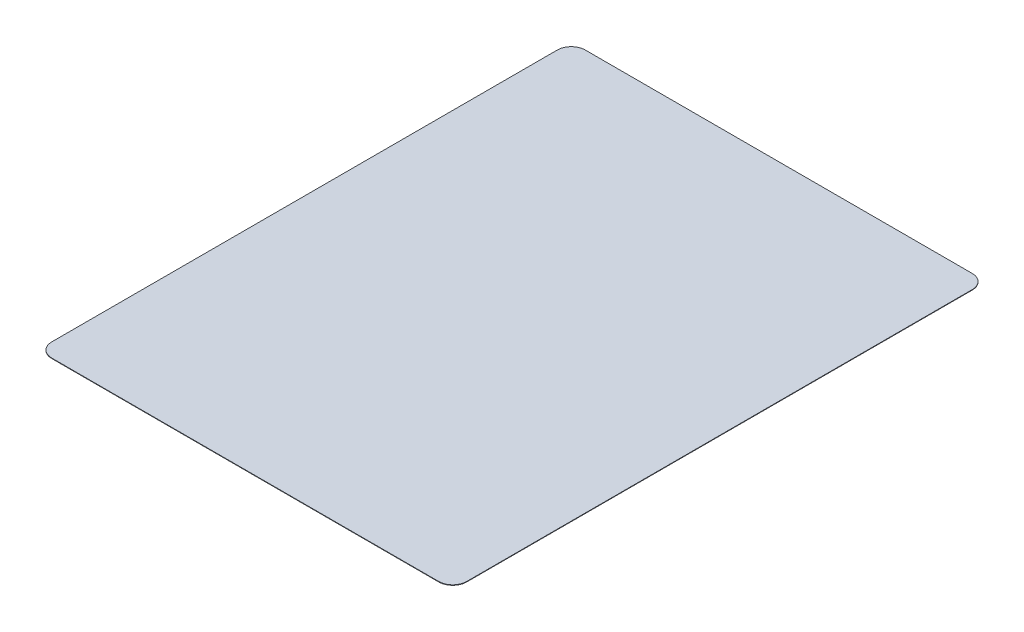
ISO-10303-21;
HEADER;
FILE_DESCRIPTION(('STEP AP214'),'2;1');
FILE_NAME('part.step','',(''),(''),'','','');
FILE_SCHEMA(('AUTOMOTIVE_DESIGN { 1 0 10303 214 1 1 1 1 }'));
ENDSEC;
DATA;
#1=APPLICATION_CONTEXT('core data for automotive mechanical design processes');
#2=APPLICATION_PROTOCOL_DEFINITION('international standard','automotive_design',2000,#1);
#3=PRODUCT_CONTEXT('',#1,'mechanical');
#4=PRODUCT('Part','Part','',(#3));
#5=PRODUCT_RELATED_PRODUCT_CATEGORY('part','',(#4));
#6=PRODUCT_DEFINITION_FORMATION('','',#4);
#7=PRODUCT_DEFINITION_CONTEXT('part definition',#1,'design');
#8=PRODUCT_DEFINITION('design','',#6,#7);
#9=PRODUCT_DEFINITION_SHAPE('','',#8);
#10=(LENGTH_UNIT() NAMED_UNIT(*) SI_UNIT(.MILLI.,.METRE.));
#11=(NAMED_UNIT(*) PLANE_ANGLE_UNIT() SI_UNIT($,.RADIAN.));
#12=(NAMED_UNIT(*) SI_UNIT($,.STERADIAN.) SOLID_ANGLE_UNIT());
#13=UNCERTAINTY_MEASURE_WITH_UNIT(LENGTH_MEASURE(1.E-05),#10,'distance_accuracy_value','');
#14=(GEOMETRIC_REPRESENTATION_CONTEXT(3) GLOBAL_UNCERTAINTY_ASSIGNED_CONTEXT((#13)) GLOBAL_UNIT_ASSIGNED_CONTEXT((#10,
#11,#12)) REPRESENTATION_CONTEXT('',''));
#15=CARTESIAN_POINT('',(0.,0.,0.));
#16=DIRECTION('',(0.,0.,1.));
#17=DIRECTION('',(1.,0.,0.));
#18=AXIS2_PLACEMENT_3D('',#15,#16,#17);
#19=CARTESIAN_POINT('',(-44.45,0.1,57.15));
#20=DIRECTION('',(1.,0.,0.));
#21=DIRECTION('',(0.,0.,-1.));
#22=AXIS2_PLACEMENT_3D('',#19,#20,#21);
#23=PLANE('',#22);
#24=DIRECTION('',(0.,0.,1.));
#25=VECTOR('',#24,1.);
#26=CARTESIAN_POINT('',(-44.45,0.,57.15));
#27=LINE('',#26,#25);
#28=CARTESIAN_POINT('',(-44.45,0.,-54.15));
#29=VERTEX_POINT('',#28);
#30=CARTESIAN_POINT('',(-44.45,0.,54.15));
#31=VERTEX_POINT('',#30);
#32=EDGE_CURVE('E140',#29,#31,#27,.T.);
#33=ORIENTED_EDGE('',*,*,#32,.T.);
#34=DIRECTION('',(0.,-1.,0.));
#35=VECTOR('',#34,1.);
#36=CARTESIAN_POINT('',(-44.45,0.1,54.15));
#37=LINE('',#36,#35);
#38=CARTESIAN_POINT('',(-44.45,0.1,54.15));
#39=VERTEX_POINT('',#38);
#40=EDGE_CURVE('E118',#31,#39,#37,.F.);
#41=ORIENTED_EDGE('',*,*,#40,.T.);
#42=DIRECTION('',(0.,0.,1.));
#43=VECTOR('',#42,1.);
#44=CARTESIAN_POINT('',(-44.45,0.1,57.15));
#45=LINE('',#44,#43);
#46=CARTESIAN_POINT('',(-44.45,0.1,-54.15));
#47=VERTEX_POINT('',#46);
#48=EDGE_CURVE('E152',#47,#39,#45,.T.);
#49=ORIENTED_EDGE('',*,*,#48,.F.);
#50=DIRECTION('',(0.,-1.,0.));
#51=VECTOR('',#50,1.);
#52=CARTESIAN_POINT('',(-44.45,0.1,-54.15));
#53=LINE('',#52,#51);
#54=EDGE_CURVE('E123',#47,#29,#53,.T.);
#55=ORIENTED_EDGE('',*,*,#54,.T.);
#56=EDGE_LOOP('',(#33,#41,#49,#55));
#57=FACE_BOUND('',#56,.T.);
#58=ADVANCED_FACE('F38',(#57),#23,.F.);
#59=CARTESIAN_POINT('',(44.45,0.1,57.15));
#60=DIRECTION('',(0.,0.,-1.));
#61=DIRECTION('',(-1.,0.,0.));
#62=AXIS2_PLACEMENT_3D('',#59,#60,#61);
#63=PLANE('',#62);
#64=DIRECTION('',(1.,0.,0.));
#65=VECTOR('',#64,1.);
#66=CARTESIAN_POINT('',(44.45,0.1,57.15));
#67=LINE('',#66,#65);
#68=CARTESIAN_POINT('',(-41.45,0.1,57.15));
#69=VERTEX_POINT('',#68);
#70=CARTESIAN_POINT('',(41.45,0.1,57.15));
#71=VERTEX_POINT('',#70);
#72=EDGE_CURVE('E133',#69,#71,#67,.T.);
#73=ORIENTED_EDGE('',*,*,#72,.F.);
#74=DIRECTION('',(0.,-1.,0.));
#75=VECTOR('',#74,1.);
#76=CARTESIAN_POINT('',(-41.45,0.1,57.15));
#77=LINE('',#76,#75);
#78=CARTESIAN_POINT('',(-41.45,0.,57.15));
#79=VERTEX_POINT('',#78);
#80=EDGE_CURVE('E117',#69,#79,#77,.T.);
#81=ORIENTED_EDGE('',*,*,#80,.T.);
#82=DIRECTION('',(1.,0.,0.));
#83=VECTOR('',#82,1.);
#84=CARTESIAN_POINT('',(44.45,0.,57.15));
#85=LINE('',#84,#83);
#86=CARTESIAN_POINT('',(41.45,0.,57.15));
#87=VERTEX_POINT('',#86);
#88=EDGE_CURVE('E130',#79,#87,#85,.T.);
#89=ORIENTED_EDGE('',*,*,#88,.T.);
#90=DIRECTION('',(0.,-1.,0.));
#91=VECTOR('',#90,1.);
#92=CARTESIAN_POINT('',(41.45,0.1,57.15));
#93=LINE('',#92,#91);
#94=EDGE_CURVE('E135',#87,#71,#93,.F.);
#95=ORIENTED_EDGE('',*,*,#94,.T.);
#96=EDGE_LOOP('',(#73,#81,#89,#95));
#97=FACE_BOUND('',#96,.T.);
#98=ADVANCED_FACE('F129',(#97),#63,.F.);
#99=CARTESIAN_POINT('',(44.45,0.1,57.15));
#100=DIRECTION('',(-1.,0.,0.));
#101=DIRECTION('',(0.,0.,1.));
#102=AXIS2_PLACEMENT_3D('',#99,#100,#101);
#103=PLANE('',#102);
#104=DIRECTION('',(0.,0.,-1.));
#105=VECTOR('',#104,1.);
#106=CARTESIAN_POINT('',(44.45,0.,57.15));
#107=LINE('',#106,#105);
#108=CARTESIAN_POINT('',(44.45,0.,54.15));
#109=VERTEX_POINT('',#108);
#110=CARTESIAN_POINT('',(44.45,0.,-54.15));
#111=VERTEX_POINT('',#110);
#112=EDGE_CURVE('E139',#109,#111,#107,.T.);
#113=ORIENTED_EDGE('',*,*,#112,.T.);
#114=DIRECTION('',(0.,-1.,0.));
#115=VECTOR('',#114,1.);
#116=CARTESIAN_POINT('',(44.45,0.1,-54.15));
#117=LINE('',#116,#115);
#118=CARTESIAN_POINT('',(44.45,0.1,-54.15));
#119=VERTEX_POINT('',#118);
#120=EDGE_CURVE('E11',#111,#119,#117,.F.);
#121=ORIENTED_EDGE('',*,*,#120,.T.);
#122=DIRECTION('',(0.,0.,-1.));
#123=VECTOR('',#122,1.);
#124=CARTESIAN_POINT('',(44.45,0.1,57.15));
#125=LINE('',#124,#123);
#126=CARTESIAN_POINT('',(44.45,0.1,54.15));
#127=VERTEX_POINT('',#126);
#128=EDGE_CURVE('E185',#127,#119,#125,.T.);
#129=ORIENTED_EDGE('',*,*,#128,.F.);
#130=DIRECTION('',(0.,-1.,0.));
#131=VECTOR('',#130,1.);
#132=CARTESIAN_POINT('',(44.45,0.1,54.15));
#133=LINE('',#132,#131);
#134=EDGE_CURVE('E47',#127,#109,#133,.T.);
#135=ORIENTED_EDGE('',*,*,#134,.T.);
#136=EDGE_LOOP('',(#113,#121,#129,#135));
#137=FACE_BOUND('',#136,.T.);
#138=ADVANCED_FACE('F183',(#137),#103,.F.);
#139=CARTESIAN_POINT('',(44.45,0.1,-57.15));
#140=DIRECTION('',(0.,0.,1.));
#141=DIRECTION('',(1.,0.,0.));
#142=AXIS2_PLACEMENT_3D('',#139,#140,#141);
#143=PLANE('',#142);
#144=DIRECTION('',(-1.,0.,0.));
#145=VECTOR('',#144,1.);
#146=CARTESIAN_POINT('',(44.45,0.,-57.15));
#147=LINE('',#146,#145);
#148=CARTESIAN_POINT('',(41.45,0.,-57.15));
#149=VERTEX_POINT('',#148);
#150=CARTESIAN_POINT('',(-41.45,0.,-57.15));
#151=VERTEX_POINT('',#150);
#152=EDGE_CURVE('E144',#149,#151,#147,.T.);
#153=ORIENTED_EDGE('',*,*,#152,.T.);
#154=DIRECTION('',(0.,-1.,0.));
#155=VECTOR('',#154,1.);
#156=CARTESIAN_POINT('',(-41.45,0.1,-57.15));
#157=LINE('',#156,#155);
#158=CARTESIAN_POINT('',(-41.45,0.1,-57.15));
#159=VERTEX_POINT('',#158);
#160=EDGE_CURVE('E57',#151,#159,#157,.F.);
#161=ORIENTED_EDGE('',*,*,#160,.T.);
#162=DIRECTION('',(-1.,0.,0.));
#163=VECTOR('',#162,1.);
#164=CARTESIAN_POINT('',(44.45,0.1,-57.15));
#165=LINE('',#164,#163);
#166=CARTESIAN_POINT('',(41.45,0.1,-57.15));
#167=VERTEX_POINT('',#166);
#168=EDGE_CURVE('E153',#167,#159,#165,.T.);
#169=ORIENTED_EDGE('',*,*,#168,.F.);
#170=DIRECTION('',(0.,-1.,0.));
#171=VECTOR('',#170,1.);
#172=CARTESIAN_POINT('',(41.45,0.1,-57.15));
#173=LINE('',#172,#171);
#174=EDGE_CURVE('E174',#167,#149,#173,.T.);
#175=ORIENTED_EDGE('',*,*,#174,.T.);
#176=EDGE_LOOP('',(#153,#161,#169,#175));
#177=FACE_BOUND('',#176,.T.);
#178=ADVANCED_FACE('F192',(#177),#143,.F.);
#179=CARTESIAN_POINT('',(0.,0.1,0.));
#180=DIRECTION('',(0.,1.,0.));
#181=DIRECTION('',(0.,0.,1.));
#182=AXIS2_PLACEMENT_3D('',#179,#180,#181);
#183=PLANE('',#182);
#184=ORIENTED_EDGE('',*,*,#48,.T.);
#185=CARTESIAN_POINT('',(-41.45,0.1,54.15));
#186=DIRECTION('',(0.,1.,0.));
#187=DIRECTION('',(0.,0.,1.));
#188=AXIS2_PLACEMENT_3D('',#185,#186,#187);
#189=CIRCLE('',#188,3.);
#190=EDGE_CURVE('E172',#39,#69,#189,.T.);
#191=ORIENTED_EDGE('',*,*,#190,.T.);
#192=ORIENTED_EDGE('',*,*,#72,.T.);
#193=CARTESIAN_POINT('',(41.45,0.1,54.15));
#194=DIRECTION('',(0.,1.,0.));
#195=DIRECTION('',(0.,0.,1.));
#196=AXIS2_PLACEMENT_3D('',#193,#194,#195);
#197=CIRCLE('',#196,3.);
#198=EDGE_CURVE('E165',#71,#127,#197,.T.);
#199=ORIENTED_EDGE('',*,*,#198,.T.);
#200=ORIENTED_EDGE('',*,*,#128,.T.);
#201=CARTESIAN_POINT('',(41.45,0.1,-54.15));
#202=DIRECTION('',(0.,1.,0.));
#203=DIRECTION('',(0.,0.,1.));
#204=AXIS2_PLACEMENT_3D('',#201,#202,#203);
#205=CIRCLE('',#204,3.);
#206=EDGE_CURVE('E66',#119,#167,#205,.T.);
#207=ORIENTED_EDGE('',*,*,#206,.T.);
#208=ORIENTED_EDGE('',*,*,#168,.T.);
#209=CARTESIAN_POINT('',(-41.45,0.1,-54.15));
#210=DIRECTION('',(0.,1.,0.));
#211=DIRECTION('',(0.,0.,1.));
#212=AXIS2_PLACEMENT_3D('',#209,#210,#211);
#213=CIRCLE('',#212,3.);
#214=EDGE_CURVE('E169',#159,#47,#213,.T.);
#215=ORIENTED_EDGE('',*,*,#214,.T.);
#216=EDGE_LOOP('',(#184,#191,#192,#199,#200,#207,#208,#215));
#217=FACE_BOUND('',#216,.T.);
#218=ADVANCED_FACE('F202',(#217),#183,.T.);
#219=CARTESIAN_POINT('',(0.,0.,0.));
#220=DIRECTION('',(0.,1.,0.));
#221=DIRECTION('',(0.,0.,1.));
#222=AXIS2_PLACEMENT_3D('',#219,#220,#221);
#223=PLANE('',#222);
#224=ORIENTED_EDGE('',*,*,#88,.F.);
#225=CARTESIAN_POINT('',(-41.45,0.,54.15));
#226=DIRECTION('',(0.,1.,0.));
#227=DIRECTION('',(0.,0.,1.));
#228=AXIS2_PLACEMENT_3D('',#225,#226,#227);
#229=CIRCLE('',#228,3.);
#230=EDGE_CURVE('E113',#79,#31,#229,.F.);
#231=ORIENTED_EDGE('',*,*,#230,.T.);
#232=ORIENTED_EDGE('',*,*,#32,.F.);
#233=CARTESIAN_POINT('',(-41.45,0.,-54.15));
#234=DIRECTION('',(0.,1.,0.));
#235=DIRECTION('',(0.,0.,1.));
#236=AXIS2_PLACEMENT_3D('',#233,#234,#235);
#237=CIRCLE('',#236,3.);
#238=EDGE_CURVE('E124',#29,#151,#237,.F.);
#239=ORIENTED_EDGE('',*,*,#238,.T.);
#240=ORIENTED_EDGE('',*,*,#152,.F.);
#241=CARTESIAN_POINT('',(41.45,0.,-54.15));
#242=DIRECTION('',(0.,1.,0.));
#243=DIRECTION('',(0.,0.,1.));
#244=AXIS2_PLACEMENT_3D('',#241,#242,#243);
#245=CIRCLE('',#244,3.);
#246=EDGE_CURVE('E156',#149,#111,#245,.F.);
#247=ORIENTED_EDGE('',*,*,#246,.T.);
#248=ORIENTED_EDGE('',*,*,#112,.F.);
#249=CARTESIAN_POINT('',(41.45,0.,54.15));
#250=DIRECTION('',(0.,1.,0.));
#251=DIRECTION('',(0.,0.,1.));
#252=AXIS2_PLACEMENT_3D('',#249,#250,#251);
#253=CIRCLE('',#252,3.);
#254=EDGE_CURVE('E134',#109,#87,#253,.F.);
#255=ORIENTED_EDGE('',*,*,#254,.T.);
#256=EDGE_LOOP('',(#224,#231,#232,#239,#240,#247,#248,#255));
#257=FACE_BOUND('',#256,.T.);
#258=ADVANCED_FACE('F137',(#257),#223,.F.);
#259=CARTESIAN_POINT('',(-41.45,0.1,54.15));
#260=DIRECTION('',(0.,-1.,0.));
#261=DIRECTION('',(0.,0.,-1.));
#262=AXIS2_PLACEMENT_3D('',#259,#260,#261);
#263=CYLINDRICAL_SURFACE('',#262,3.);
#264=ORIENTED_EDGE('',*,*,#190,.F.);
#265=ORIENTED_EDGE('',*,*,#40,.F.);
#266=ORIENTED_EDGE('',*,*,#230,.F.);
#267=ORIENTED_EDGE('',*,*,#80,.F.);
#268=EDGE_LOOP('',(#264,#265,#266,#267));
#269=FACE_BOUND('',#268,.T.);
#270=ADVANCED_FACE('F116',(#269),#263,.T.);
#271=CARTESIAN_POINT('',(-41.45,0.1,-54.15));
#272=DIRECTION('',(0.,-1.,0.));
#273=DIRECTION('',(0.,0.,-1.));
#274=AXIS2_PLACEMENT_3D('',#271,#272,#273);
#275=CYLINDRICAL_SURFACE('',#274,3.);
#276=ORIENTED_EDGE('',*,*,#214,.F.);
#277=ORIENTED_EDGE('',*,*,#160,.F.);
#278=ORIENTED_EDGE('',*,*,#238,.F.);
#279=ORIENTED_EDGE('',*,*,#54,.F.);
#280=EDGE_LOOP('',(#276,#277,#278,#279));
#281=FACE_BOUND('',#280,.T.);
#282=ADVANCED_FACE('F206',(#281),#275,.T.);
#283=CARTESIAN_POINT('',(41.45,0.1,-54.15));
#284=DIRECTION('',(0.,-1.,0.));
#285=DIRECTION('',(0.,0.,-1.));
#286=AXIS2_PLACEMENT_3D('',#283,#284,#285);
#287=CYLINDRICAL_SURFACE('',#286,3.);
#288=ORIENTED_EDGE('',*,*,#206,.F.);
#289=ORIENTED_EDGE('',*,*,#120,.F.);
#290=ORIENTED_EDGE('',*,*,#246,.F.);
#291=ORIENTED_EDGE('',*,*,#174,.F.);
#292=EDGE_LOOP('',(#288,#289,#290,#291));
#293=FACE_BOUND('',#292,.T.);
#294=ADVANCED_FACE('F191',(#293),#287,.T.);
#295=CARTESIAN_POINT('',(41.45,0.1,54.15));
#296=DIRECTION('',(0.,-1.,0.));
#297=DIRECTION('',(0.,0.,-1.));
#298=AXIS2_PLACEMENT_3D('',#295,#296,#297);
#299=CYLINDRICAL_SURFACE('',#298,3.);
#300=ORIENTED_EDGE('',*,*,#198,.F.);
#301=ORIENTED_EDGE('',*,*,#94,.F.);
#302=ORIENTED_EDGE('',*,*,#254,.F.);
#303=ORIENTED_EDGE('',*,*,#134,.F.);
#304=EDGE_LOOP('',(#300,#301,#302,#303));
#305=FACE_BOUND('',#304,.T.);
#306=ADVANCED_FACE('F40',(#305),#299,.T.);
#307=CLOSED_SHELL('',(#58,#98,#138,#178,#218,#258,#270,#282,#294,#306));
#308=MANIFOLD_SOLID_BREP('B2',#307);
#309=ADVANCED_BREP_SHAPE_REPRESENTATION('',(#18,#308),#14);
#310=SHAPE_DEFINITION_REPRESENTATION(#9,#309);
ENDSEC;
END-ISO-10303-21;
